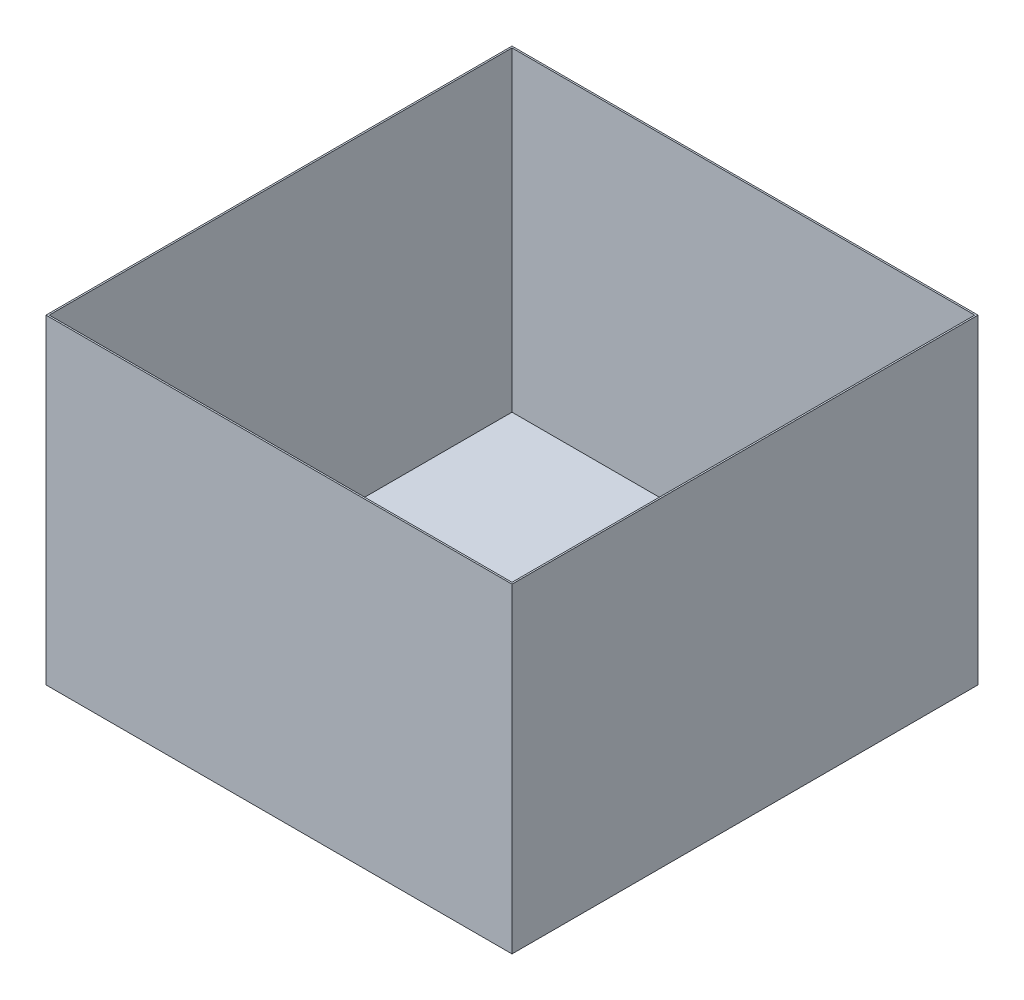
ISO-10303-21;
HEADER;
FILE_DESCRIPTION(('STEP AP214'),'2;1');
FILE_NAME('part.step','',(''),(''),'','','');
FILE_SCHEMA(('AUTOMOTIVE_DESIGN { 1 0 10303 214 1 1 1 1 }'));
ENDSEC;
DATA;
#1=APPLICATION_CONTEXT('core data for automotive mechanical design processes');
#2=APPLICATION_PROTOCOL_DEFINITION('international standard','automotive_design',2000,#1);
#3=PRODUCT_CONTEXT('',#1,'mechanical');
#4=PRODUCT('Part','Part','',(#3));
#5=PRODUCT_RELATED_PRODUCT_CATEGORY('part','',(#4));
#6=PRODUCT_DEFINITION_FORMATION('','',#4);
#7=PRODUCT_DEFINITION_CONTEXT('part definition',#1,'design');
#8=PRODUCT_DEFINITION('design','',#6,#7);
#9=PRODUCT_DEFINITION_SHAPE('','',#8);
#10=(LENGTH_UNIT() NAMED_UNIT(*) SI_UNIT(.MILLI.,.METRE.));
#11=(NAMED_UNIT(*) PLANE_ANGLE_UNIT() SI_UNIT($,.RADIAN.));
#12=(NAMED_UNIT(*) SI_UNIT($,.STERADIAN.) SOLID_ANGLE_UNIT());
#13=UNCERTAINTY_MEASURE_WITH_UNIT(LENGTH_MEASURE(1.E-05),#10,'distance_accuracy_value','');
#14=(GEOMETRIC_REPRESENTATION_CONTEXT(3) GLOBAL_UNCERTAINTY_ASSIGNED_CONTEXT((#13)) GLOBAL_UNIT_ASSIGNED_CONTEXT((#10,
#11,#12)) REPRESENTATION_CONTEXT('',''));
#15=CARTESIAN_POINT('',(0.,0.,0.));
#16=DIRECTION('',(0.,0.,1.));
#17=DIRECTION('',(1.,0.,0.));
#18=AXIS2_PLACEMENT_3D('',#15,#16,#17);
#19=CARTESIAN_POINT('',(0.,635.,0.));
#20=DIRECTION('',(0.,-1.,0.));
#21=DIRECTION('',(0.,0.,-1.));
#22=AXIS2_PLACEMENT_3D('',#19,#20,#21);
#23=PLANE('',#22);
#24=DIRECTION('',(0.,0.,-1.));
#25=VECTOR('',#24,1.);
#26=CARTESIAN_POINT('',(461.9625,635.,461.9625));
#27=LINE('',#26,#25);
#28=CARTESIAN_POINT('',(461.9625,635.,461.9625));
#29=VERTEX_POINT('',#28);
#30=CARTESIAN_POINT('',(461.9625,635.,-461.9625));
#31=VERTEX_POINT('',#30);
#32=EDGE_CURVE('E137',#29,#31,#27,.T.);
#33=ORIENTED_EDGE('',*,*,#32,.T.);
#34=DIRECTION('',(-1.,0.,0.));
#35=VECTOR('',#34,1.);
#36=CARTESIAN_POINT('',(-461.9625,635.,-461.9625));
#37=LINE('',#36,#35);
#38=CARTESIAN_POINT('',(-461.9625,635.,-461.9625));
#39=VERTEX_POINT('',#38);
#40=EDGE_CURVE('E140',#31,#39,#37,.T.);
#41=ORIENTED_EDGE('',*,*,#40,.T.);
#42=DIRECTION('',(0.,0.,1.));
#43=VECTOR('',#42,1.);
#44=CARTESIAN_POINT('',(-461.9625,635.,461.9625));
#45=LINE('',#44,#43);
#46=CARTESIAN_POINT('',(-461.9625,635.,461.9625));
#47=VERTEX_POINT('',#46);
#48=EDGE_CURVE('E143',#39,#47,#45,.T.);
#49=ORIENTED_EDGE('',*,*,#48,.T.);
#50=DIRECTION('',(1.,0.,0.));
#51=VECTOR('',#50,1.);
#52=CARTESIAN_POINT('',(-461.9625,635.,461.9625));
#53=LINE('',#52,#51);
#54=EDGE_CURVE('E145',#47,#29,#53,.T.);
#55=ORIENTED_EDGE('',*,*,#54,.T.);
#56=EDGE_LOOP('',(#33,#41,#49,#55));
#57=FACE_BOUND('',#56,.T.);
#58=DIRECTION('',(0.,0.,-1.));
#59=VECTOR('',#58,1.);
#60=CARTESIAN_POINT('',(458.7875,635.,458.7875));
#61=LINE('',#60,#59);
#62=CARTESIAN_POINT('',(458.7875,635.,458.7875));
#63=VERTEX_POINT('',#62);
#64=CARTESIAN_POINT('',(458.7875,635.,-458.7875));
#65=VERTEX_POINT('',#64);
#66=EDGE_CURVE('E124',#63,#65,#61,.T.);
#67=ORIENTED_EDGE('',*,*,#66,.F.);
#68=DIRECTION('',(1.,0.,0.));
#69=VECTOR('',#68,1.);
#70=CARTESIAN_POINT('',(-458.7875,635.,458.7875));
#71=LINE('',#70,#69);
#72=CARTESIAN_POINT('',(-458.7875,635.,458.7875));
#73=VERTEX_POINT('',#72);
#74=EDGE_CURVE('E108',#73,#63,#71,.T.);
#75=ORIENTED_EDGE('',*,*,#74,.F.);
#76=DIRECTION('',(0.,0.,1.));
#77=VECTOR('',#76,1.);
#78=CARTESIAN_POINT('',(-458.7875,635.,458.7875));
#79=LINE('',#78,#77);
#80=CARTESIAN_POINT('',(-458.7875,635.,-458.7875));
#81=VERTEX_POINT('',#80);
#82=EDGE_CURVE('E128',#81,#73,#79,.T.);
#83=ORIENTED_EDGE('',*,*,#82,.F.);
#84=DIRECTION('',(-1.,0.,0.));
#85=VECTOR('',#84,1.);
#86=CARTESIAN_POINT('',(-458.7875,635.,-458.7875));
#87=LINE('',#86,#85);
#88=EDGE_CURVE('E126',#65,#81,#87,.T.);
#89=ORIENTED_EDGE('',*,*,#88,.F.);
#90=EDGE_LOOP('',(#67,#75,#83,#89));
#91=FACE_BOUND('',#90,.T.);
#92=ADVANCED_FACE('F35',(#57,#91),#23,.F.);
#93=CARTESIAN_POINT('',(0.,0.,0.));
#94=DIRECTION('',(0.,-1.,0.));
#95=DIRECTION('',(0.,0.,-1.));
#96=AXIS2_PLACEMENT_3D('',#93,#94,#95);
#97=PLANE('',#96);
#98=DIRECTION('',(0.,0.,-1.));
#99=VECTOR('',#98,1.);
#100=CARTESIAN_POINT('',(461.9625,0.,461.9625));
#101=LINE('',#100,#99);
#102=CARTESIAN_POINT('',(461.9625,0.,461.9625));
#103=VERTEX_POINT('',#102);
#104=CARTESIAN_POINT('',(461.9625,0.,-461.9625));
#105=VERTEX_POINT('',#104);
#106=EDGE_CURVE('E136',#103,#105,#101,.T.);
#107=ORIENTED_EDGE('',*,*,#106,.F.);
#108=DIRECTION('',(1.,0.,0.));
#109=VECTOR('',#108,1.);
#110=CARTESIAN_POINT('',(-461.9625,0.,461.9625));
#111=LINE('',#110,#109);
#112=CARTESIAN_POINT('',(-461.9625,0.,461.9625));
#113=VERTEX_POINT('',#112);
#114=EDGE_CURVE('E141',#113,#103,#111,.T.);
#115=ORIENTED_EDGE('',*,*,#114,.F.);
#116=DIRECTION('',(0.,0.,1.));
#117=VECTOR('',#116,1.);
#118=CARTESIAN_POINT('',(-461.9625,0.,461.9625));
#119=LINE('',#118,#117);
#120=CARTESIAN_POINT('',(-461.9625,0.,-461.9625));
#121=VERTEX_POINT('',#120);
#122=EDGE_CURVE('E152',#121,#113,#119,.T.);
#123=ORIENTED_EDGE('',*,*,#122,.F.);
#124=DIRECTION('',(-1.,0.,0.));
#125=VECTOR('',#124,1.);
#126=CARTESIAN_POINT('',(-461.9625,0.,-461.9625));
#127=LINE('',#126,#125);
#128=EDGE_CURVE('E150',#105,#121,#127,.T.);
#129=ORIENTED_EDGE('',*,*,#128,.F.);
#130=EDGE_LOOP('',(#107,#115,#123,#129));
#131=FACE_BOUND('',#130,.T.);
#132=ADVANCED_FACE('F170',(#131),#97,.T.);
#133=CARTESIAN_POINT('',(461.9625,635.,461.9625));
#134=DIRECTION('',(-1.,0.,0.));
#135=DIRECTION('',(0.,0.,1.));
#136=AXIS2_PLACEMENT_3D('',#133,#134,#135);
#137=PLANE('',#136);
#138=ORIENTED_EDGE('',*,*,#106,.T.);
#139=DIRECTION('',(0.,-1.,0.));
#140=VECTOR('',#139,1.);
#141=CARTESIAN_POINT('',(461.9625,635.,-461.9625));
#142=LINE('',#141,#140);
#143=EDGE_CURVE('E11',#31,#105,#142,.T.);
#144=ORIENTED_EDGE('',*,*,#143,.F.);
#145=ORIENTED_EDGE('',*,*,#32,.F.);
#146=DIRECTION('',(0.,-1.,0.));
#147=VECTOR('',#146,1.);
#148=CARTESIAN_POINT('',(461.9625,635.,461.9625));
#149=LINE('',#148,#147);
#150=EDGE_CURVE('E147',#29,#103,#149,.T.);
#151=ORIENTED_EDGE('',*,*,#150,.T.);
#152=EDGE_LOOP('',(#138,#144,#145,#151));
#153=FACE_BOUND('',#152,.T.);
#154=ADVANCED_FACE('F37',(#153),#137,.F.);
#155=CARTESIAN_POINT('',(-461.9625,635.,-461.9625));
#156=DIRECTION('',(0.,0.,1.));
#157=DIRECTION('',(1.,0.,0.));
#158=AXIS2_PLACEMENT_3D('',#155,#156,#157);
#159=PLANE('',#158);
#160=ORIENTED_EDGE('',*,*,#128,.T.);
#161=DIRECTION('',(0.,-1.,0.));
#162=VECTOR('',#161,1.);
#163=CARTESIAN_POINT('',(-461.9625,635.,-461.9625));
#164=LINE('',#163,#162);
#165=EDGE_CURVE('E43',#39,#121,#164,.T.);
#166=ORIENTED_EDGE('',*,*,#165,.F.);
#167=ORIENTED_EDGE('',*,*,#40,.F.);
#168=ORIENTED_EDGE('',*,*,#143,.T.);
#169=EDGE_LOOP('',(#160,#166,#167,#168));
#170=FACE_BOUND('',#169,.T.);
#171=ADVANCED_FACE('F180',(#170),#159,.F.);
#172=CARTESIAN_POINT('',(-461.9625,635.,461.9625));
#173=DIRECTION('',(1.,0.,0.));
#174=DIRECTION('',(0.,0.,-1.));
#175=AXIS2_PLACEMENT_3D('',#172,#173,#174);
#176=PLANE('',#175);
#177=ORIENTED_EDGE('',*,*,#122,.T.);
#178=DIRECTION('',(0.,-1.,0.));
#179=VECTOR('',#178,1.);
#180=CARTESIAN_POINT('',(-461.9625,635.,461.9625));
#181=LINE('',#180,#179);
#182=EDGE_CURVE('E157',#47,#113,#181,.T.);
#183=ORIENTED_EDGE('',*,*,#182,.F.);
#184=ORIENTED_EDGE('',*,*,#48,.F.);
#185=ORIENTED_EDGE('',*,*,#165,.T.);
#186=EDGE_LOOP('',(#177,#183,#184,#185));
#187=FACE_BOUND('',#186,.T.);
#188=ADVANCED_FACE('F164',(#187),#176,.F.);
#189=CARTESIAN_POINT('',(-461.9625,635.,461.9625));
#190=DIRECTION('',(0.,0.,-1.));
#191=DIRECTION('',(-1.,0.,0.));
#192=AXIS2_PLACEMENT_3D('',#189,#190,#191);
#193=PLANE('',#192);
#194=ORIENTED_EDGE('',*,*,#114,.T.);
#195=ORIENTED_EDGE('',*,*,#150,.F.);
#196=ORIENTED_EDGE('',*,*,#54,.F.);
#197=ORIENTED_EDGE('',*,*,#182,.T.);
#198=EDGE_LOOP('',(#194,#195,#196,#197));
#199=FACE_BOUND('',#198,.T.);
#200=ADVANCED_FACE('F173',(#199),#193,.F.);
#201=CARTESIAN_POINT('',(458.7875,635.,458.7875));
#202=DIRECTION('',(-1.,0.,0.));
#203=DIRECTION('',(0.,0.,1.));
#204=AXIS2_PLACEMENT_3D('',#201,#202,#203);
#205=PLANE('',#204);
#206=DIRECTION('',(0.,0.,-1.));
#207=VECTOR('',#206,1.);
#208=CARTESIAN_POINT('',(458.7875,9.525,0.));
#209=LINE('',#208,#207);
#210=CARTESIAN_POINT('',(458.7875,9.525,458.7875));
#211=VERTEX_POINT('',#210);
#212=CARTESIAN_POINT('',(458.7875,9.52500000000023,-458.7875));
#213=VERTEX_POINT('',#212);
#214=EDGE_CURVE('E114',#211,#213,#209,.T.);
#215=ORIENTED_EDGE('',*,*,#214,.F.);
#216=DIRECTION('',(0.,-1.,0.));
#217=VECTOR('',#216,1.);
#218=CARTESIAN_POINT('',(458.7875,635.,458.7875));
#219=LINE('',#218,#217);
#220=EDGE_CURVE('E102',#63,#211,#219,.T.);
#221=ORIENTED_EDGE('',*,*,#220,.F.);
#222=ORIENTED_EDGE('',*,*,#66,.T.);
#223=DIRECTION('',(0.,-1.,0.));
#224=VECTOR('',#223,1.);
#225=CARTESIAN_POINT('',(458.7875,635.,-458.7875));
#226=LINE('',#225,#224);
#227=EDGE_CURVE('E116',#65,#213,#226,.T.);
#228=ORIENTED_EDGE('',*,*,#227,.T.);
#229=EDGE_LOOP('',(#215,#221,#222,#228));
#230=FACE_BOUND('',#229,.T.);
#231=ADVANCED_FACE('F115',(#230),#205,.T.);
#232=CARTESIAN_POINT('',(-458.7875,635.,-458.7875));
#233=DIRECTION('',(0.,0.,1.));
#234=DIRECTION('',(1.,0.,0.));
#235=AXIS2_PLACEMENT_3D('',#232,#233,#234);
#236=PLANE('',#235);
#237=DIRECTION('',(1.,0.,0.));
#238=VECTOR('',#237,1.);
#239=CARTESIAN_POINT('',(0.,9.525,-458.7875));
#240=LINE('',#239,#238);
#241=CARTESIAN_POINT('',(-458.7875,9.52500000000023,-458.7875));
#242=VERTEX_POINT('',#241);
#243=EDGE_CURVE('E50',#242,#213,#240,.T.);
#244=ORIENTED_EDGE('',*,*,#243,.T.);
#245=ORIENTED_EDGE('',*,*,#227,.F.);
#246=ORIENTED_EDGE('',*,*,#88,.T.);
#247=DIRECTION('',(0.,-1.,0.));
#248=VECTOR('',#247,1.);
#249=CARTESIAN_POINT('',(-458.7875,635.,-458.7875));
#250=LINE('',#249,#248);
#251=EDGE_CURVE('E133',#81,#242,#250,.T.);
#252=ORIENTED_EDGE('',*,*,#251,.T.);
#253=EDGE_LOOP('',(#244,#245,#246,#252));
#254=FACE_BOUND('',#253,.T.);
#255=ADVANCED_FACE('F200',(#254),#236,.T.);
#256=CARTESIAN_POINT('',(-458.7875,635.,458.7875));
#257=DIRECTION('',(1.,0.,0.));
#258=DIRECTION('',(0.,0.,-1.));
#259=AXIS2_PLACEMENT_3D('',#256,#257,#258);
#260=PLANE('',#259);
#261=DIRECTION('',(0.,0.,-1.));
#262=VECTOR('',#261,1.);
#263=CARTESIAN_POINT('',(-458.7875,9.525,0.));
#264=LINE('',#263,#262);
#265=CARTESIAN_POINT('',(-458.7875,9.52500000000023,458.7875));
#266=VERTEX_POINT('',#265);
#267=EDGE_CURVE('E58',#266,#242,#264,.T.);
#268=ORIENTED_EDGE('',*,*,#267,.T.);
#269=ORIENTED_EDGE('',*,*,#251,.F.);
#270=ORIENTED_EDGE('',*,*,#82,.T.);
#271=DIRECTION('',(0.,-1.,0.));
#272=VECTOR('',#271,1.);
#273=CARTESIAN_POINT('',(-458.7875,635.,458.7875));
#274=LINE('',#273,#272);
#275=EDGE_CURVE('E111',#73,#266,#274,.T.);
#276=ORIENTED_EDGE('',*,*,#275,.T.);
#277=EDGE_LOOP('',(#268,#269,#270,#276));
#278=FACE_BOUND('',#277,.T.);
#279=ADVANCED_FACE('F204',(#278),#260,.T.);
#280=CARTESIAN_POINT('',(-458.7875,635.,458.7875));
#281=DIRECTION('',(0.,0.,-1.));
#282=DIRECTION('',(-1.,0.,0.));
#283=AXIS2_PLACEMENT_3D('',#280,#281,#282);
#284=PLANE('',#283);
#285=DIRECTION('',(1.,0.,0.));
#286=VECTOR('',#285,1.);
#287=CARTESIAN_POINT('',(0.,9.525,458.7875));
#288=LINE('',#287,#286);
#289=EDGE_CURVE('E106',#266,#211,#288,.T.);
#290=ORIENTED_EDGE('',*,*,#289,.F.);
#291=ORIENTED_EDGE('',*,*,#275,.F.);
#292=ORIENTED_EDGE('',*,*,#74,.T.);
#293=ORIENTED_EDGE('',*,*,#220,.T.);
#294=EDGE_LOOP('',(#290,#291,#292,#293));
#295=FACE_BOUND('',#294,.T.);
#296=ADVANCED_FACE('F104',(#295),#284,.T.);
#297=CARTESIAN_POINT('',(0.,9.525,0.));
#298=DIRECTION('',(0.,1.,0.));
#299=DIRECTION('',(0.,0.,1.));
#300=AXIS2_PLACEMENT_3D('',#297,#298,#299);
#301=PLANE('',#300);
#302=ORIENTED_EDGE('',*,*,#289,.T.);
#303=ORIENTED_EDGE('',*,*,#214,.T.);
#304=ORIENTED_EDGE('',*,*,#243,.F.);
#305=ORIENTED_EDGE('',*,*,#267,.F.);
#306=EDGE_LOOP('',(#302,#303,#304,#305));
#307=FACE_BOUND('',#306,.T.);
#308=ADVANCED_FACE('F119',(#307),#301,.T.);
#309=CLOSED_SHELL('',(#92,#132,#154,#171,#188,#200,#231,#255,#279,#296,#308));
#310=MANIFOLD_SOLID_BREP('B2',#309);
#311=ADVANCED_BREP_SHAPE_REPRESENTATION('',(#18,#310),#14);
#312=SHAPE_DEFINITION_REPRESENTATION(#9,#311);
ENDSEC;
END-ISO-10303-21;
